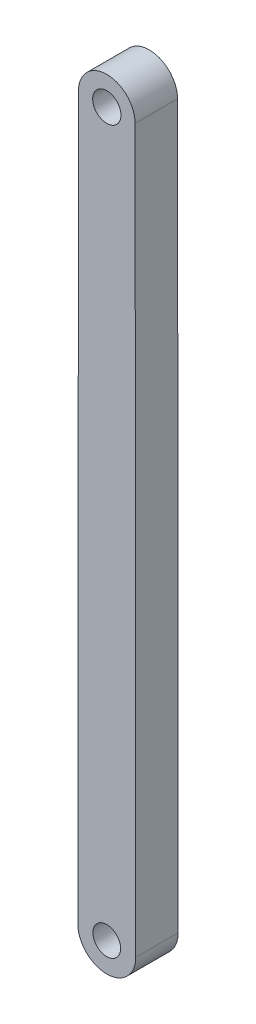
ISO-10303-21;
HEADER;
FILE_DESCRIPTION(('STEP AP214'),'2;1');
FILE_NAME('part.step','',(''),(''),'','','');
FILE_SCHEMA(('AUTOMOTIVE_DESIGN { 1 0 10303 214 1 1 1 1 }'));
ENDSEC;
DATA;
#1=APPLICATION_CONTEXT('core data for automotive mechanical design processes');
#2=APPLICATION_PROTOCOL_DEFINITION('international standard','automotive_design',2000,#1);
#3=PRODUCT_CONTEXT('',#1,'mechanical');
#4=PRODUCT('Part','Part','',(#3));
#5=PRODUCT_RELATED_PRODUCT_CATEGORY('part','',(#4));
#6=PRODUCT_DEFINITION_FORMATION('','',#4);
#7=PRODUCT_DEFINITION_CONTEXT('part definition',#1,'design');
#8=PRODUCT_DEFINITION('design','',#6,#7);
#9=PRODUCT_DEFINITION_SHAPE('','',#8);
#10=(LENGTH_UNIT() NAMED_UNIT(*) SI_UNIT(.MILLI.,.METRE.));
#11=(NAMED_UNIT(*) PLANE_ANGLE_UNIT() SI_UNIT($,.RADIAN.));
#12=(NAMED_UNIT(*) SI_UNIT($,.STERADIAN.) SOLID_ANGLE_UNIT());
#13=UNCERTAINTY_MEASURE_WITH_UNIT(LENGTH_MEASURE(1.E-05),#10,'distance_accuracy_value','');
#14=(GEOMETRIC_REPRESENTATION_CONTEXT(3) GLOBAL_UNCERTAINTY_ASSIGNED_CONTEXT((#13)) GLOBAL_UNIT_ASSIGNED_CONTEXT((#10,
#11,#12)) REPRESENTATION_CONTEXT('',''));
#15=CARTESIAN_POINT('',(0.,0.,0.));
#16=DIRECTION('',(0.,0.,1.));
#17=DIRECTION('',(1.,0.,0.));
#18=AXIS2_PLACEMENT_3D('',#15,#16,#17);
#19=CARTESIAN_POINT('',(-429.970787236435,34.4663226170122,3.));
#20=DIRECTION('',(0.,0.,1.));
#21=DIRECTION('',(1.,0.,0.));
#22=AXIS2_PLACEMENT_3D('',#19,#20,#21);
#23=PLANE('',#22);
#24=CARTESIAN_POINT('',(-429.968678349619,85.4663226170122,3.));
#25=DIRECTION('',(0.,0.,1.));
#26=DIRECTION('',(1.,0.,0.));
#27=AXIS2_PLACEMENT_3D('',#24,#25,#26);
#28=CIRCLE('',#27,0.999999999999998);
#29=CARTESIAN_POINT('',(-428.968678349619,85.4663226170122,3.));
#30=VERTEX_POINT('',#29);
#31=EDGE_CURVE('E102',#30,#30,#28,.T.);
#32=ORIENTED_EDGE('',*,*,#31,.F.);
#33=EDGE_LOOP('',(#32));
#34=FACE_BOUND('',#33,.T.);
#35=CARTESIAN_POINT('',(-429.970787236435,34.4663226170122,3.));
#36=DIRECTION('',(0.,0.,1.));
#37=DIRECTION('',(1.,0.,0.));
#38=AXIS2_PLACEMENT_3D('',#35,#36,#37);
#39=CIRCLE('',#38,2.04725174603591);
#40=CARTESIAN_POINT('',(-432.018038023595,34.4683040609293,3.));
#41=VERTEX_POINT('',#40);
#42=CARTESIAN_POINT('',(-427.923536292408,34.4681347503269,3.));
#43=VERTEX_POINT('',#42);
#44=EDGE_CURVE('E87',#41,#43,#39,.T.);
#45=ORIENTED_EDGE('',*,*,#44,.T.);
#46=DIRECTION('',(-0.000885154118544238,0.999999608251016,0.));
#47=VECTOR('',#46,1.);
#48=CARTESIAN_POINT('',(-427.923536292408,34.4681347503269,3.));
#49=LINE('',#48,#47);
#50=CARTESIAN_POINT('',(-427.968679133117,85.4680929252493,3.));
#51=VERTEX_POINT('',#50);
#52=EDGE_CURVE('E82',#43,#51,#49,.T.);
#53=ORIENTED_EDGE('',*,*,#52,.T.);
#54=CARTESIAN_POINT('',(-429.968678349619,85.4663226170122,3.));
#55=DIRECTION('',(0.,0.,1.));
#56=DIRECTION('',(1.,0.,0.));
#57=AXIS2_PLACEMENT_3D('',#54,#55,#56);
#58=CIRCLE('',#57,2.00000000000006);
#59=CARTESIAN_POINT('',(-431.968677412875,85.4682583280657,3.));
#60=VERTEX_POINT('',#59);
#61=EDGE_CURVE('E85',#51,#60,#58,.T.);
#62=ORIENTED_EDGE('',*,*,#61,.T.);
#63=DIRECTION('',(-0.000967855526752117,-0.99999953162773,0.));
#64=VECTOR('',#63,1.);
#65=CARTESIAN_POINT('',(-431.968677412875,85.4682583280657,3.));
#66=LINE('',#65,#64);
#67=EDGE_CURVE('E52',#60,#41,#66,.T.);
#68=ORIENTED_EDGE('',*,*,#67,.T.);
#69=EDGE_LOOP('',(#45,#53,#62,#68));
#70=FACE_BOUND('',#69,.T.);
#71=CARTESIAN_POINT('',(-429.970787236435,34.4663226170122,3.));
#72=DIRECTION('',(0.,0.,1.));
#73=DIRECTION('',(1.,0.,0.));
#74=AXIS2_PLACEMENT_3D('',#71,#72,#73);
#75=CIRCLE('',#74,0.980392253926941);
#76=CARTESIAN_POINT('',(-428.990394982508,34.4663226170122,3.));
#77=VERTEX_POINT('',#76);
#78=EDGE_CURVE('E117',#77,#77,#75,.T.);
#79=ORIENTED_EDGE('',*,*,#78,.F.);
#80=EDGE_LOOP('',(#79));
#81=FACE_BOUND('',#80,.T.);
#82=ADVANCED_FACE('F35',(#34,#70,#81),#23,.T.);
#83=CARTESIAN_POINT('',(-429.970787236435,34.4663226170122,0.));
#84=DIRECTION('',(0.,0.,1.));
#85=DIRECTION('',(1.,0.,0.));
#86=AXIS2_PLACEMENT_3D('',#83,#84,#85);
#87=PLANE('',#86);
#88=CARTESIAN_POINT('',(-429.970787236435,34.4663226170122,0.));
#89=DIRECTION('',(0.,0.,1.));
#90=DIRECTION('',(1.,0.,0.));
#91=AXIS2_PLACEMENT_3D('',#88,#89,#90);
#92=CIRCLE('',#91,2.04725174603591);
#93=CARTESIAN_POINT('',(-432.018038023595,34.4683040609293,0.));
#94=VERTEX_POINT('',#93);
#95=CARTESIAN_POINT('',(-427.923536292408,34.4681347503269,0.));
#96=VERTEX_POINT('',#95);
#97=EDGE_CURVE('E99',#94,#96,#92,.T.);
#98=ORIENTED_EDGE('',*,*,#97,.F.);
#99=DIRECTION('',(-0.000967855526752117,-0.99999953162773,0.));
#100=VECTOR('',#99,1.);
#101=CARTESIAN_POINT('',(-431.968677412875,85.4682583280657,0.));
#102=LINE('',#101,#100);
#103=CARTESIAN_POINT('',(-431.968677412875,85.4682583280657,0.));
#104=VERTEX_POINT('',#103);
#105=EDGE_CURVE('E75',#104,#94,#102,.T.);
#106=ORIENTED_EDGE('',*,*,#105,.F.);
#107=CARTESIAN_POINT('',(-429.968678349619,85.4663226170122,0.));
#108=DIRECTION('',(0.,0.,1.));
#109=DIRECTION('',(1.,0.,0.));
#110=AXIS2_PLACEMENT_3D('',#107,#108,#109);
#111=CIRCLE('',#110,2.00000000000006);
#112=CARTESIAN_POINT('',(-427.968679133117,85.4680929252493,0.));
#113=VERTEX_POINT('',#112);
#114=EDGE_CURVE('E69',#113,#104,#111,.T.);
#115=ORIENTED_EDGE('',*,*,#114,.F.);
#116=DIRECTION('',(-0.000885154118544238,0.999999608251016,0.));
#117=VECTOR('',#116,1.);
#118=CARTESIAN_POINT('',(-427.923536292408,34.4681347503269,0.));
#119=LINE('',#118,#117);
#120=EDGE_CURVE('E91',#96,#113,#119,.T.);
#121=ORIENTED_EDGE('',*,*,#120,.F.);
#122=EDGE_LOOP('',(#98,#106,#115,#121));
#123=FACE_BOUND('',#122,.T.);
#124=CARTESIAN_POINT('',(-429.968678349619,85.4663226170122,0.));
#125=DIRECTION('',(0.,0.,1.));
#126=DIRECTION('',(1.,0.,0.));
#127=AXIS2_PLACEMENT_3D('',#124,#125,#126);
#128=CIRCLE('',#127,0.999999999999998);
#129=CARTESIAN_POINT('',(-428.968678349619,85.4663226170122,0.));
#130=VERTEX_POINT('',#129);
#131=EDGE_CURVE('E114',#130,#130,#128,.T.);
#132=ORIENTED_EDGE('',*,*,#131,.T.);
#133=EDGE_LOOP('',(#132));
#134=FACE_BOUND('',#133,.T.);
#135=CARTESIAN_POINT('',(-429.970787236435,34.4663226170122,0.));
#136=DIRECTION('',(0.,0.,1.));
#137=DIRECTION('',(1.,0.,0.));
#138=AXIS2_PLACEMENT_3D('',#135,#136,#137);
#139=CIRCLE('',#138,0.980392253926941);
#140=CARTESIAN_POINT('',(-428.990394982508,34.4663226170122,0.));
#141=VERTEX_POINT('',#140);
#142=EDGE_CURVE('E120',#141,#141,#139,.T.);
#143=ORIENTED_EDGE('',*,*,#142,.T.);
#144=EDGE_LOOP('',(#143));
#145=FACE_BOUND('',#144,.T.);
#146=ADVANCED_FACE('F110',(#123,#134,#145),#87,.F.);
#147=CARTESIAN_POINT('',(-429.970787236435,34.4663226170122,3.));
#148=DIRECTION('',(0.,0.,-1.));
#149=DIRECTION('',(-1.,0.,0.));
#150=AXIS2_PLACEMENT_3D('',#147,#148,#149);
#151=CYLINDRICAL_SURFACE('',#150,2.04725174603591);
#152=ORIENTED_EDGE('',*,*,#97,.T.);
#153=DIRECTION('',(0.,0.,-1.));
#154=VECTOR('',#153,1.);
#155=CARTESIAN_POINT('',(-427.923536292408,34.4681347503269,3.));
#156=LINE('',#155,#154);
#157=EDGE_CURVE('E11',#43,#96,#156,.T.);
#158=ORIENTED_EDGE('',*,*,#157,.F.);
#159=ORIENTED_EDGE('',*,*,#44,.F.);
#160=DIRECTION('',(0.,0.,-1.));
#161=VECTOR('',#160,1.);
#162=CARTESIAN_POINT('',(-432.018038023595,34.4683040609293,3.));
#163=LINE('',#162,#161);
#164=EDGE_CURVE('E95',#41,#94,#163,.T.);
#165=ORIENTED_EDGE('',*,*,#164,.T.);
#166=EDGE_LOOP('',(#152,#158,#159,#165));
#167=FACE_BOUND('',#166,.T.);
#168=ADVANCED_FACE('F37',(#167),#151,.T.);
#169=CARTESIAN_POINT('',(-427.923536292408,34.4681347503269,3.));
#170=DIRECTION('',(-0.999999608251017,-0.000885154118544238,0.));
#171=DIRECTION('',(0.000885154118544238,-0.999999608251017,0.));
#172=AXIS2_PLACEMENT_3D('',#169,#170,#171);
#173=PLANE('',#172);
#174=ORIENTED_EDGE('',*,*,#120,.T.);
#175=DIRECTION('',(0.,0.,-1.));
#176=VECTOR('',#175,1.);
#177=CARTESIAN_POINT('',(-427.968679133117,85.4680929252493,3.));
#178=LINE('',#177,#176);
#179=EDGE_CURVE('E44',#51,#113,#178,.T.);
#180=ORIENTED_EDGE('',*,*,#179,.F.);
#181=ORIENTED_EDGE('',*,*,#52,.F.);
#182=ORIENTED_EDGE('',*,*,#157,.T.);
#183=EDGE_LOOP('',(#174,#180,#181,#182));
#184=FACE_BOUND('',#183,.T.);
#185=ADVANCED_FACE('F90',(#184),#173,.F.);
#186=CARTESIAN_POINT('',(-429.968678349619,85.4663226170122,3.));
#187=DIRECTION('',(0.,0.,-1.));
#188=DIRECTION('',(-1.,0.,0.));
#189=AXIS2_PLACEMENT_3D('',#186,#187,#188);
#190=CYLINDRICAL_SURFACE('',#189,2.00000000000006);
#191=ORIENTED_EDGE('',*,*,#114,.T.);
#192=DIRECTION('',(0.,0.,-1.));
#193=VECTOR('',#192,1.);
#194=CARTESIAN_POINT('',(-431.968677412875,85.4682583280657,3.));
#195=LINE('',#194,#193);
#196=EDGE_CURVE('E92',#60,#104,#195,.T.);
#197=ORIENTED_EDGE('',*,*,#196,.F.);
#198=ORIENTED_EDGE('',*,*,#61,.F.);
#199=ORIENTED_EDGE('',*,*,#179,.T.);
#200=EDGE_LOOP('',(#191,#197,#198,#199));
#201=FACE_BOUND('',#200,.T.);
#202=ADVANCED_FACE('F93',(#201),#190,.T.);
#203=CARTESIAN_POINT('',(-431.968677412875,85.4682583280657,3.));
#204=DIRECTION('',(0.99999953162773,-0.000967855526752117,0.));
#205=DIRECTION('',(0.000967855526752117,0.99999953162773,0.));
#206=AXIS2_PLACEMENT_3D('',#203,#204,#205);
#207=PLANE('',#206);
#208=ORIENTED_EDGE('',*,*,#105,.T.);
#209=ORIENTED_EDGE('',*,*,#164,.F.);
#210=ORIENTED_EDGE('',*,*,#67,.F.);
#211=ORIENTED_EDGE('',*,*,#196,.T.);
#212=EDGE_LOOP('',(#208,#209,#210,#211));
#213=FACE_BOUND('',#212,.T.);
#214=ADVANCED_FACE('F107',(#213),#207,.F.);
#215=CARTESIAN_POINT('',(-429.968678349619,85.4663226170122,3.));
#216=DIRECTION('',(0.,0.,-1.));
#217=DIRECTION('',(-1.,0.,0.));
#218=AXIS2_PLACEMENT_3D('',#215,#216,#217);
#219=CYLINDRICAL_SURFACE('',#218,0.999999999999998);
#220=ORIENTED_EDGE('',*,*,#31,.T.);
#221=EDGE_LOOP('',(#220));
#222=FACE_BOUND('',#221,.T.);
#223=ORIENTED_EDGE('',*,*,#131,.F.);
#224=EDGE_LOOP('',(#223));
#225=FACE_BOUND('',#224,.T.);
#226=ADVANCED_FACE('F137',(#222,#225),#219,.F.);
#227=CARTESIAN_POINT('',(-429.970787236435,34.4663226170122,3.));
#228=DIRECTION('',(0.,0.,-1.));
#229=DIRECTION('',(-1.,0.,0.));
#230=AXIS2_PLACEMENT_3D('',#227,#228,#229);
#231=CYLINDRICAL_SURFACE('',#230,0.980392253926941);
#232=ORIENTED_EDGE('',*,*,#78,.T.);
#233=EDGE_LOOP('',(#232));
#234=FACE_BOUND('',#233,.T.);
#235=ORIENTED_EDGE('',*,*,#142,.F.);
#236=EDGE_LOOP('',(#235));
#237=FACE_BOUND('',#236,.T.);
#238=ADVANCED_FACE('F126',(#234,#237),#231,.F.);
#239=CLOSED_SHELL('',(#82,#146,#168,#185,#202,#214,#226,#238));
#240=MANIFOLD_SOLID_BREP('B2',#239);
#241=ADVANCED_BREP_SHAPE_REPRESENTATION('',(#18,#240),#14);
#242=SHAPE_DEFINITION_REPRESENTATION(#9,#241);
ENDSEC;
END-ISO-10303-21;
